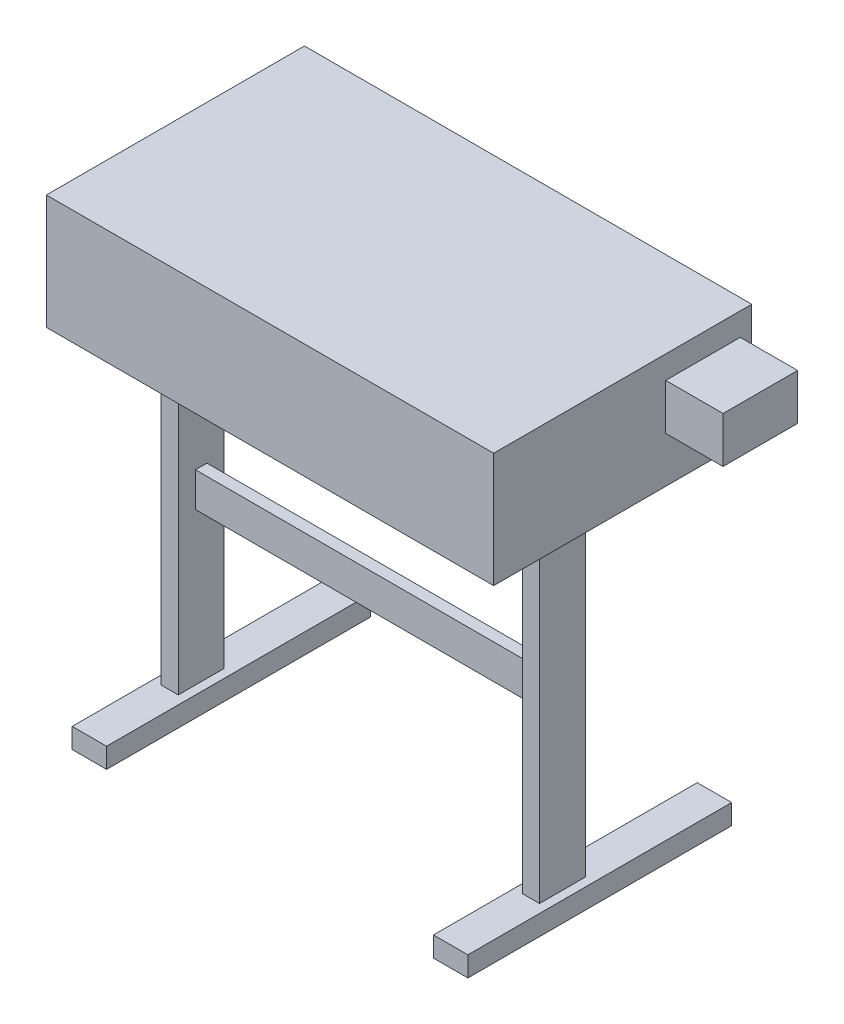
ISO-10303-21;
HEADER;
FILE_DESCRIPTION(('STEP AP214'),'2;1');
FILE_NAME('part.step','',(''),(''),'','','');
FILE_SCHEMA(('AUTOMOTIVE_DESIGN { 1 0 10303 214 1 1 1 1 }'));
ENDSEC;
DATA;
#1=APPLICATION_CONTEXT('core data for automotive mechanical design processes');
#2=APPLICATION_PROTOCOL_DEFINITION('international standard','automotive_design',2000,#1);
#3=PRODUCT_CONTEXT('',#1,'mechanical');
#4=PRODUCT('Part','Part','',(#3));
#5=PRODUCT_RELATED_PRODUCT_CATEGORY('part','',(#4));
#6=PRODUCT_DEFINITION_FORMATION('','',#4);
#7=PRODUCT_DEFINITION_CONTEXT('part definition',#1,'design');
#8=PRODUCT_DEFINITION('design','',#6,#7);
#9=PRODUCT_DEFINITION_SHAPE('','',#8);
#10=(LENGTH_UNIT() NAMED_UNIT(*) SI_UNIT(.MILLI.,.METRE.));
#11=(NAMED_UNIT(*) PLANE_ANGLE_UNIT() SI_UNIT($,.RADIAN.));
#12=(NAMED_UNIT(*) SI_UNIT($,.STERADIAN.) SOLID_ANGLE_UNIT());
#13=UNCERTAINTY_MEASURE_WITH_UNIT(LENGTH_MEASURE(1.E-05),#10,'distance_accuracy_value','');
#14=(GEOMETRIC_REPRESENTATION_CONTEXT(3) GLOBAL_UNCERTAINTY_ASSIGNED_CONTEXT((#13)) GLOBAL_UNIT_ASSIGNED_CONTEXT((#10,
#11,#12)) REPRESENTATION_CONTEXT('',''));
#15=CARTESIAN_POINT('',(0.,0.,0.));
#16=DIRECTION('',(0.,0.,1.));
#17=DIRECTION('',(1.,0.,0.));
#18=AXIS2_PLACEMENT_3D('',#15,#16,#17);
#19=CARTESIAN_POINT('',(-419.1,-781.05,393.7));
#20=DIRECTION('',(-1.,0.,0.));
#21=DIRECTION('',(0.,0.,1.));
#22=AXIS2_PLACEMENT_3D('',#19,#20,#21);
#23=PLANE('',#22);
#24=DIRECTION('',(0.,1.,0.));
#25=VECTOR('',#24,1.);
#26=CARTESIAN_POINT('',(-419.1,-781.05,292.1));
#27=LINE('',#26,#25);
#28=CARTESIAN_POINT('',(-419.1,-736.6,292.1));
#29=VERTEX_POINT('',#28);
#30=CARTESIAN_POINT('',(-419.1,0.,292.1));
#31=VERTEX_POINT('',#30);
#32=EDGE_CURVE('E300',#29,#31,#27,.T.);
#33=ORIENTED_EDGE('',*,*,#32,.F.);
#34=DIRECTION('',(0.,0.,1.));
#35=VECTOR('',#34,1.);
#36=CARTESIAN_POINT('',(-419.1,-736.6,393.7));
#37=LINE('',#36,#35);
#38=CARTESIAN_POINT('',(-419.1,-736.6,393.7));
#39=VERTEX_POINT('',#38);
#40=EDGE_CURVE('E227',#29,#39,#37,.T.);
#41=ORIENTED_EDGE('',*,*,#40,.T.);
#42=DIRECTION('',(0.,1.,0.));
#43=VECTOR('',#42,1.);
#44=CARTESIAN_POINT('',(-419.1,-781.05,393.7));
#45=LINE('',#44,#43);
#46=CARTESIAN_POINT('',(-419.1,0.,393.7));
#47=VERTEX_POINT('',#46);
#48=EDGE_CURVE('E326',#39,#47,#45,.T.);
#49=ORIENTED_EDGE('',*,*,#48,.T.);
#50=DIRECTION('',(0.,0.,1.));
#51=VECTOR('',#50,1.);
#52=CARTESIAN_POINT('',(-419.1,0.,393.7));
#53=LINE('',#52,#51);
#54=EDGE_CURVE('E342',#31,#47,#53,.T.);
#55=ORIENTED_EDGE('',*,*,#54,.F.);
#56=EDGE_LOOP('',(#33,#41,#49,#55));
#57=FACE_BOUND('',#56,.T.);
#58=ADVANCED_FACE('F49',(#57),#23,.T.);
#59=CARTESIAN_POINT('',(-419.1,-781.05,292.1));
#60=DIRECTION('',(0.,0.,-1.));
#61=DIRECTION('',(-1.,0.,0.));
#62=AXIS2_PLACEMENT_3D('',#59,#60,#61);
#63=PLANE('',#62);
#64=DIRECTION('',(0.,1.,0.));
#65=VECTOR('',#64,1.);
#66=CARTESIAN_POINT('',(-381.,-781.05,292.1));
#67=LINE('',#66,#65);
#68=CARTESIAN_POINT('',(-381.,-736.6,292.1));
#69=VERTEX_POINT('',#68);
#70=CARTESIAN_POINT('',(-381.,0.,292.1));
#71=VERTEX_POINT('',#70);
#72=EDGE_CURVE('E331',#69,#71,#67,.T.);
#73=ORIENTED_EDGE('',*,*,#72,.F.);
#74=DIRECTION('',(-1.,0.,0.));
#75=VECTOR('',#74,1.);
#76=CARTESIAN_POINT('',(-419.1,-736.6,292.1));
#77=LINE('',#76,#75);
#78=EDGE_CURVE('E224',#69,#29,#77,.T.);
#79=ORIENTED_EDGE('',*,*,#78,.T.);
#80=ORIENTED_EDGE('',*,*,#32,.T.);
#81=DIRECTION('',(-1.,0.,0.));
#82=VECTOR('',#81,1.);
#83=CARTESIAN_POINT('',(-419.1,0.,292.1));
#84=LINE('',#83,#82);
#85=EDGE_CURVE('E328',#71,#31,#84,.T.);
#86=ORIENTED_EDGE('',*,*,#85,.F.);
#87=EDGE_LOOP('',(#73,#79,#80,#86));
#88=FACE_BOUND('',#87,.T.);
#89=ADVANCED_FACE('F376',(#88),#63,.T.);
#90=CARTESIAN_POINT('',(-381.,-781.05,393.7));
#91=DIRECTION('',(1.,0.,0.));
#92=DIRECTION('',(0.,0.,-1.));
#93=AXIS2_PLACEMENT_3D('',#90,#91,#92);
#94=PLANE('',#93);
#95=DIRECTION('',(0.,0.,-1.));
#96=VECTOR('',#95,1.);
#97=CARTESIAN_POINT('',(-381.,-400.05,330.200000000001));
#98=LINE('',#97,#96);
#99=CARTESIAN_POINT('',(-381.,-400.05,355.600000000001));
#100=VERTEX_POINT('',#99);
#101=CARTESIAN_POINT('',(-381.,-400.05,330.2));
#102=VERTEX_POINT('',#101);
#103=EDGE_CURVE('E293',#100,#102,#98,.T.);
#104=ORIENTED_EDGE('',*,*,#103,.F.);
#105=DIRECTION('',(0.,-1.,0.));
#106=VECTOR('',#105,1.);
#107=CARTESIAN_POINT('',(-381.,-323.85,355.600000000001));
#108=LINE('',#107,#106);
#109=CARTESIAN_POINT('',(-381.,-323.85,355.600000000001));
#110=VERTEX_POINT('',#109);
#111=EDGE_CURVE('E290',#110,#100,#108,.T.);
#112=ORIENTED_EDGE('',*,*,#111,.F.);
#113=DIRECTION('',(0.,0.,1.));
#114=VECTOR('',#113,1.);
#115=CARTESIAN_POINT('',(-381.,-323.85,330.200000000001));
#116=LINE('',#115,#114);
#117=CARTESIAN_POINT('',(-381.,-323.85,330.2));
#118=VERTEX_POINT('',#117);
#119=EDGE_CURVE('E294',#118,#110,#116,.T.);
#120=ORIENTED_EDGE('',*,*,#119,.F.);
#121=DIRECTION('',(0.,1.,0.));
#122=VECTOR('',#121,1.);
#123=CARTESIAN_POINT('',(-381.,-323.85,330.200000000001));
#124=LINE('',#123,#122);
#125=EDGE_CURVE('E297',#102,#118,#124,.T.);
#126=ORIENTED_EDGE('',*,*,#125,.F.);
#127=EDGE_LOOP('',(#104,#112,#120,#126));
#128=FACE_BOUND('',#127,.T.);
#129=DIRECTION('',(0.,1.,0.));
#130=VECTOR('',#129,1.);
#131=CARTESIAN_POINT('',(-381.,-781.05,393.7));
#132=LINE('',#131,#130);
#133=CARTESIAN_POINT('',(-381.,-736.6,393.7));
#134=VERTEX_POINT('',#133);
#135=CARTESIAN_POINT('',(-381.,0.,393.7));
#136=VERTEX_POINT('',#135);
#137=EDGE_CURVE('E329',#134,#136,#132,.T.);
#138=ORIENTED_EDGE('',*,*,#137,.F.);
#139=DIRECTION('',(0.,0.,-1.));
#140=VECTOR('',#139,1.);
#141=CARTESIAN_POINT('',(-381.,-736.6,393.7));
#142=LINE('',#141,#140);
#143=EDGE_CURVE('E64',#134,#69,#142,.T.);
#144=ORIENTED_EDGE('',*,*,#143,.T.);
#145=ORIENTED_EDGE('',*,*,#72,.T.);
#146=DIRECTION('',(0.,0.,-1.));
#147=VECTOR('',#146,1.);
#148=CARTESIAN_POINT('',(-381.,0.,393.7));
#149=LINE('',#148,#147);
#150=EDGE_CURVE('E336',#136,#71,#149,.T.);
#151=ORIENTED_EDGE('',*,*,#150,.F.);
#152=EDGE_LOOP('',(#138,#144,#145,#151));
#153=FACE_BOUND('',#152,.T.);
#154=ADVANCED_FACE('F383',(#128,#153),#94,.T.);
#155=CARTESIAN_POINT('',(-419.1,-781.05,393.7));
#156=DIRECTION('',(0.,0.,1.));
#157=DIRECTION('',(1.,0.,0.));
#158=AXIS2_PLACEMENT_3D('',#155,#156,#157);
#159=PLANE('',#158);
#160=ORIENTED_EDGE('',*,*,#48,.F.);
#161=DIRECTION('',(1.,0.,0.));
#162=VECTOR('',#161,1.);
#163=CARTESIAN_POINT('',(-419.1,-736.6,393.7));
#164=LINE('',#163,#162);
#165=EDGE_CURVE('E12',#39,#134,#164,.T.);
#166=ORIENTED_EDGE('',*,*,#165,.T.);
#167=ORIENTED_EDGE('',*,*,#137,.T.);
#168=DIRECTION('',(1.,0.,0.));
#169=VECTOR('',#168,1.);
#170=CARTESIAN_POINT('',(-419.1,0.,393.7));
#171=LINE('',#170,#169);
#172=EDGE_CURVE('E339',#47,#136,#171,.T.);
#173=ORIENTED_EDGE('',*,*,#172,.F.);
#174=EDGE_LOOP('',(#160,#166,#167,#173));
#175=FACE_BOUND('',#174,.T.);
#176=ADVANCED_FACE('F371',(#175),#159,.T.);
#177=CARTESIAN_POINT('',(381.,-781.05,393.7));
#178=DIRECTION('',(-1.,0.,0.));
#179=DIRECTION('',(0.,0.,1.));
#180=AXIS2_PLACEMENT_3D('',#177,#178,#179);
#181=PLANE('',#180);
#182=DIRECTION('',(0.,-1.,0.));
#183=VECTOR('',#182,1.);
#184=CARTESIAN_POINT('',(381.,-323.85,330.2));
#185=LINE('',#184,#183);
#186=CARTESIAN_POINT('',(381.,-323.85,330.2));
#187=VERTEX_POINT('',#186);
#188=CARTESIAN_POINT('',(381.,-400.05,330.2));
#189=VERTEX_POINT('',#188);
#190=EDGE_CURVE('E284',#187,#189,#185,.T.);
#191=ORIENTED_EDGE('',*,*,#190,.F.);
#192=DIRECTION('',(0.,0.,-1.));
#193=VECTOR('',#192,1.);
#194=CARTESIAN_POINT('',(381.,-323.85,330.2));
#195=LINE('',#194,#193);
#196=CARTESIAN_POINT('',(381.,-323.85,355.6));
#197=VERTEX_POINT('',#196);
#198=EDGE_CURVE('E309',#197,#187,#195,.T.);
#199=ORIENTED_EDGE('',*,*,#198,.F.);
#200=DIRECTION('',(0.,1.,0.));
#201=VECTOR('',#200,1.);
#202=CARTESIAN_POINT('',(381.,-323.85,355.6));
#203=LINE('',#202,#201);
#204=CARTESIAN_POINT('',(381.,-400.05,355.6));
#205=VERTEX_POINT('',#204);
#206=EDGE_CURVE('E306',#205,#197,#203,.T.);
#207=ORIENTED_EDGE('',*,*,#206,.F.);
#208=DIRECTION('',(0.,0.,1.));
#209=VECTOR('',#208,1.);
#210=CARTESIAN_POINT('',(381.,-400.05,330.2));
#211=LINE('',#210,#209);
#212=EDGE_CURVE('E303',#189,#205,#211,.T.);
#213=ORIENTED_EDGE('',*,*,#212,.F.);
#214=EDGE_LOOP('',(#191,#199,#207,#213));
#215=FACE_BOUND('',#214,.T.);
#216=DIRECTION('',(0.,1.,0.));
#217=VECTOR('',#216,1.);
#218=CARTESIAN_POINT('',(381.,-781.05,292.1));
#219=LINE('',#218,#217);
#220=CARTESIAN_POINT('',(381.,-736.6,292.1));
#221=VERTEX_POINT('',#220);
#222=CARTESIAN_POINT('',(381.,0.,292.1));
#223=VERTEX_POINT('',#222);
#224=EDGE_CURVE('E282',#221,#223,#219,.T.);
#225=ORIENTED_EDGE('',*,*,#224,.F.);
#226=DIRECTION('',(0.,0.,1.));
#227=VECTOR('',#226,1.);
#228=CARTESIAN_POINT('',(381.,-736.6,393.7));
#229=LINE('',#228,#227);
#230=CARTESIAN_POINT('',(381.,-736.6,393.7));
#231=VERTEX_POINT('',#230);
#232=EDGE_CURVE('E266',#221,#231,#229,.T.);
#233=ORIENTED_EDGE('',*,*,#232,.T.);
#234=DIRECTION('',(0.,1.,0.));
#235=VECTOR('',#234,1.);
#236=CARTESIAN_POINT('',(381.,-781.05,393.7));
#237=LINE('',#236,#235);
#238=CARTESIAN_POINT('',(381.,0.,393.7));
#239=VERTEX_POINT('',#238);
#240=EDGE_CURVE('E281',#231,#239,#237,.T.);
#241=ORIENTED_EDGE('',*,*,#240,.T.);
#242=DIRECTION('',(0.,0.,1.));
#243=VECTOR('',#242,1.);
#244=CARTESIAN_POINT('',(381.,0.,393.7));
#245=LINE('',#244,#243);
#246=EDGE_CURVE('E269',#223,#239,#245,.T.);
#247=ORIENTED_EDGE('',*,*,#246,.F.);
#248=EDGE_LOOP('',(#225,#233,#241,#247));
#249=FACE_BOUND('',#248,.T.);
#250=ADVANCED_FACE('F359',(#215,#249),#181,.T.);
#251=CARTESIAN_POINT('',(381.,-781.05,292.1));
#252=DIRECTION('',(0.,0.,-1.));
#253=DIRECTION('',(-1.,0.,0.));
#254=AXIS2_PLACEMENT_3D('',#251,#252,#253);
#255=PLANE('',#254);
#256=DIRECTION('',(0.,1.,0.));
#257=VECTOR('',#256,1.);
#258=CARTESIAN_POINT('',(419.1,-781.05,292.1));
#259=LINE('',#258,#257);
#260=CARTESIAN_POINT('',(419.1,-736.6,292.1));
#261=VERTEX_POINT('',#260);
#262=CARTESIAN_POINT('',(419.1,0.,292.1));
#263=VERTEX_POINT('',#262);
#264=EDGE_CURVE('E285',#261,#263,#259,.T.);
#265=ORIENTED_EDGE('',*,*,#264,.F.);
#266=DIRECTION('',(-1.,0.,0.));
#267=VECTOR('',#266,1.);
#268=CARTESIAN_POINT('',(381.,-736.6,292.1));
#269=LINE('',#268,#267);
#270=EDGE_CURVE('E263',#261,#221,#269,.T.);
#271=ORIENTED_EDGE('',*,*,#270,.T.);
#272=ORIENTED_EDGE('',*,*,#224,.T.);
#273=DIRECTION('',(-1.,0.,0.));
#274=VECTOR('',#273,1.);
#275=CARTESIAN_POINT('',(381.,0.,292.1));
#276=LINE('',#275,#274);
#277=EDGE_CURVE('E278',#263,#223,#276,.T.);
#278=ORIENTED_EDGE('',*,*,#277,.F.);
#279=EDGE_LOOP('',(#265,#271,#272,#278));
#280=FACE_BOUND('',#279,.T.);
#281=ADVANCED_FACE('F363',(#280),#255,.T.);
#282=CARTESIAN_POINT('',(419.1,-781.05,393.7));
#283=DIRECTION('',(1.,0.,0.));
#284=DIRECTION('',(0.,0.,-1.));
#285=AXIS2_PLACEMENT_3D('',#282,#283,#284);
#286=PLANE('',#285);
#287=DIRECTION('',(0.,1.,0.));
#288=VECTOR('',#287,1.);
#289=CARTESIAN_POINT('',(419.1,-781.05,393.7));
#290=LINE('',#289,#288);
#291=CARTESIAN_POINT('',(419.1,-736.6,393.7));
#292=VERTEX_POINT('',#291);
#293=CARTESIAN_POINT('',(419.1,0.,393.7));
#294=VERTEX_POINT('',#293);
#295=EDGE_CURVE('E287',#292,#294,#290,.T.);
#296=ORIENTED_EDGE('',*,*,#295,.F.);
#297=DIRECTION('',(0.,0.,-1.));
#298=VECTOR('',#297,1.);
#299=CARTESIAN_POINT('',(419.1,-736.6,393.7));
#300=LINE('',#299,#298);
#301=EDGE_CURVE('E71',#292,#261,#300,.T.);
#302=ORIENTED_EDGE('',*,*,#301,.T.);
#303=ORIENTED_EDGE('',*,*,#264,.T.);
#304=DIRECTION('',(0.,0.,-1.));
#305=VECTOR('',#304,1.);
#306=CARTESIAN_POINT('',(419.1,0.,393.7));
#307=LINE('',#306,#305);
#308=EDGE_CURVE('E275',#294,#263,#307,.T.);
#309=ORIENTED_EDGE('',*,*,#308,.F.);
#310=EDGE_LOOP('',(#296,#302,#303,#309));
#311=FACE_BOUND('',#310,.T.);
#312=ADVANCED_FACE('F351',(#311),#286,.T.);
#313=CARTESIAN_POINT('',(381.,-781.05,393.7));
#314=DIRECTION('',(0.,0.,1.));
#315=DIRECTION('',(1.,0.,0.));
#316=AXIS2_PLACEMENT_3D('',#313,#314,#315);
#317=PLANE('',#316);
#318=ORIENTED_EDGE('',*,*,#240,.F.);
#319=DIRECTION('',(1.,0.,0.));
#320=VECTOR('',#319,1.);
#321=CARTESIAN_POINT('',(381.,-736.6,393.7));
#322=LINE('',#321,#320);
#323=EDGE_CURVE('E57',#231,#292,#322,.T.);
#324=ORIENTED_EDGE('',*,*,#323,.T.);
#325=ORIENTED_EDGE('',*,*,#295,.T.);
#326=DIRECTION('',(1.,0.,0.));
#327=VECTOR('',#326,1.);
#328=CARTESIAN_POINT('',(381.,0.,393.7));
#329=LINE('',#328,#327);
#330=EDGE_CURVE('E272',#239,#294,#329,.T.);
#331=ORIENTED_EDGE('',*,*,#330,.F.);
#332=EDGE_LOOP('',(#318,#324,#325,#331));
#333=FACE_BOUND('',#332,.T.);
#334=ADVANCED_FACE('F347',(#333),#317,.T.);
#335=CARTESIAN_POINT('',(0.,0.,0.));
#336=DIRECTION('',(0.,-1.,0.));
#337=DIRECTION('',(0.,0.,-1.));
#338=AXIS2_PLACEMENT_3D('',#335,#336,#337);
#339=PLANE('',#338);
#340=ORIENTED_EDGE('',*,*,#54,.T.);
#341=ORIENTED_EDGE('',*,*,#172,.T.);
#342=ORIENTED_EDGE('',*,*,#150,.T.);
#343=ORIENTED_EDGE('',*,*,#85,.T.);
#344=EDGE_LOOP('',(#340,#341,#342,#343));
#345=FACE_BOUND('',#344,.T.);
#346=ADVANCED_FACE('F396',(#345),#339,.F.);
#347=CARTESIAN_POINT('',(-461.321852568277,-323.85,330.200000000001));
#348=DIRECTION('',(0.,-1.,0.));
#349=DIRECTION('',(0.,0.,-1.));
#350=AXIS2_PLACEMENT_3D('',#347,#348,#349);
#351=PLANE('',#350);
#352=DIRECTION('',(1.,0.,0.));
#353=VECTOR('',#352,1.);
#354=CARTESIAN_POINT('',(-461.321852568277,-323.85,330.200000000001));
#355=LINE('',#354,#353);
#356=EDGE_CURVE('E312',#118,#187,#355,.T.);
#357=ORIENTED_EDGE('',*,*,#356,.F.);
#358=ORIENTED_EDGE('',*,*,#119,.T.);
#359=DIRECTION('',(1.,0.,0.));
#360=VECTOR('',#359,1.);
#361=CARTESIAN_POINT('',(-461.321852568277,-323.85,355.600000000001));
#362=LINE('',#361,#360);
#363=EDGE_CURVE('E315',#110,#197,#362,.T.);
#364=ORIENTED_EDGE('',*,*,#363,.T.);
#365=ORIENTED_EDGE('',*,*,#198,.T.);
#366=EDGE_LOOP('',(#357,#358,#364,#365));
#367=FACE_BOUND('',#366,.T.);
#368=ADVANCED_FACE('F398',(#367),#351,.F.);
#369=CARTESIAN_POINT('',(-461.321852568277,-323.85,355.600000000001));
#370=DIRECTION('',(0.,0.,-1.));
#371=DIRECTION('',(-1.,0.,0.));
#372=AXIS2_PLACEMENT_3D('',#369,#370,#371);
#373=PLANE('',#372);
#374=ORIENTED_EDGE('',*,*,#363,.F.);
#375=ORIENTED_EDGE('',*,*,#111,.T.);
#376=DIRECTION('',(1.,0.,0.));
#377=VECTOR('',#376,1.);
#378=CARTESIAN_POINT('',(-461.321852568277,-400.05,355.600000000001));
#379=LINE('',#378,#377);
#380=EDGE_CURVE('E318',#100,#205,#379,.T.);
#381=ORIENTED_EDGE('',*,*,#380,.T.);
#382=ORIENTED_EDGE('',*,*,#206,.T.);
#383=EDGE_LOOP('',(#374,#375,#381,#382));
#384=FACE_BOUND('',#383,.T.);
#385=ADVANCED_FACE('F403',(#384),#373,.F.);
#386=CARTESIAN_POINT('',(-461.321852568277,-400.05,330.200000000001));
#387=DIRECTION('',(0.,1.,0.));
#388=DIRECTION('',(0.,0.,1.));
#389=AXIS2_PLACEMENT_3D('',#386,#387,#388);
#390=PLANE('',#389);
#391=ORIENTED_EDGE('',*,*,#380,.F.);
#392=ORIENTED_EDGE('',*,*,#103,.T.);
#393=DIRECTION('',(1.,0.,0.));
#394=VECTOR('',#393,1.);
#395=CARTESIAN_POINT('',(-461.321852568277,-400.05,330.200000000001));
#396=LINE('',#395,#394);
#397=EDGE_CURVE('E321',#102,#189,#396,.T.);
#398=ORIENTED_EDGE('',*,*,#397,.T.);
#399=ORIENTED_EDGE('',*,*,#212,.T.);
#400=EDGE_LOOP('',(#391,#392,#398,#399));
#401=FACE_BOUND('',#400,.T.);
#402=ADVANCED_FACE('F465',(#401),#390,.F.);
#403=CARTESIAN_POINT('',(-461.321852568277,-323.85,330.200000000001));
#404=DIRECTION('',(0.,0.,1.));
#405=DIRECTION('',(1.,0.,0.));
#406=AXIS2_PLACEMENT_3D('',#403,#404,#405);
#407=PLANE('',#406);
#408=ORIENTED_EDGE('',*,*,#397,.F.);
#409=ORIENTED_EDGE('',*,*,#125,.T.);
#410=ORIENTED_EDGE('',*,*,#356,.T.);
#411=ORIENTED_EDGE('',*,*,#190,.T.);
#412=EDGE_LOOP('',(#408,#409,#410,#411));
#413=FACE_BOUND('',#412,.T.);
#414=ADVANCED_FACE('F389',(#413),#407,.F.);
#415=CARTESIAN_POINT('',(0.,0.,0.));
#416=DIRECTION('',(0.,-1.,0.));
#417=DIRECTION('',(0.,0.,-1.));
#418=AXIS2_PLACEMENT_3D('',#415,#416,#417);
#419=PLANE('',#418);
#420=ORIENTED_EDGE('',*,*,#246,.T.);
#421=ORIENTED_EDGE('',*,*,#330,.T.);
#422=ORIENTED_EDGE('',*,*,#308,.T.);
#423=ORIENTED_EDGE('',*,*,#277,.T.);
#424=EDGE_LOOP('',(#420,#421,#422,#423));
#425=FACE_BOUND('',#424,.T.);
#426=ADVANCED_FACE('F355',(#425),#419,.F.);
#427=CARTESIAN_POINT('',(361.95,-736.6,571.5));
#428=DIRECTION('',(-1.,0.,0.));
#429=DIRECTION('',(0.,0.,1.));
#430=AXIS2_PLACEMENT_3D('',#427,#428,#429);
#431=PLANE('',#430);
#432=DIRECTION('',(0.,0.,-1.));
#433=VECTOR('',#432,1.);
#434=CARTESIAN_POINT('',(361.95,-781.05,571.5));
#435=LINE('',#434,#433);
#436=CARTESIAN_POINT('',(361.95,-781.05,571.5));
#437=VERTEX_POINT('',#436);
#438=CARTESIAN_POINT('',(361.95,-781.05,-12.6999999999999));
#439=VERTEX_POINT('',#438);
#440=EDGE_CURVE('E230',#437,#439,#435,.T.);
#441=ORIENTED_EDGE('',*,*,#440,.F.);
#442=DIRECTION('',(0.,-1.,0.));
#443=VECTOR('',#442,1.);
#444=CARTESIAN_POINT('',(361.95,-736.6,571.5));
#445=LINE('',#444,#443);
#446=CARTESIAN_POINT('',(361.95,-736.6,571.5));
#447=VERTEX_POINT('',#446);
#448=EDGE_CURVE('E255',#447,#437,#445,.T.);
#449=ORIENTED_EDGE('',*,*,#448,.F.);
#450=DIRECTION('',(0.,0.,-1.));
#451=VECTOR('',#450,1.);
#452=CARTESIAN_POINT('',(361.95,-736.6,571.5));
#453=LINE('',#452,#451);
#454=CARTESIAN_POINT('',(361.95,-736.6,-12.6999999999999));
#455=VERTEX_POINT('',#454);
#456=EDGE_CURVE('E231',#447,#455,#453,.T.);
#457=ORIENTED_EDGE('',*,*,#456,.T.);
#458=DIRECTION('',(0.,-1.,0.));
#459=VECTOR('',#458,1.);
#460=CARTESIAN_POINT('',(361.95,-736.6,-12.6999999999999));
#461=LINE('',#460,#459);
#462=EDGE_CURVE('E244',#455,#439,#461,.T.);
#463=ORIENTED_EDGE('',*,*,#462,.T.);
#464=EDGE_LOOP('',(#441,#449,#457,#463));
#465=FACE_BOUND('',#464,.T.);
#466=ADVANCED_FACE('F447',(#465),#431,.T.);
#467=CARTESIAN_POINT('',(361.95,-736.6,571.5));
#468=DIRECTION('',(0.,0.,1.));
#469=DIRECTION('',(1.,0.,0.));
#470=AXIS2_PLACEMENT_3D('',#467,#468,#469);
#471=PLANE('',#470);
#472=DIRECTION('',(-1.,0.,0.));
#473=VECTOR('',#472,1.);
#474=CARTESIAN_POINT('',(361.95,-781.05,571.5));
#475=LINE('',#474,#473);
#476=CARTESIAN_POINT('',(438.15,-781.05,571.5));
#477=VERTEX_POINT('',#476);
#478=EDGE_CURVE('E235',#477,#437,#475,.T.);
#479=ORIENTED_EDGE('',*,*,#478,.F.);
#480=DIRECTION('',(0.,-1.,0.));
#481=VECTOR('',#480,1.);
#482=CARTESIAN_POINT('',(438.15,-736.6,571.5));
#483=LINE('',#482,#481);
#484=CARTESIAN_POINT('',(438.15,-736.6,571.5));
#485=VERTEX_POINT('',#484);
#486=EDGE_CURVE('E257',#485,#477,#483,.T.);
#487=ORIENTED_EDGE('',*,*,#486,.F.);
#488=DIRECTION('',(-1.,0.,0.));
#489=VECTOR('',#488,1.);
#490=CARTESIAN_POINT('',(361.95,-736.6,571.5));
#491=LINE('',#490,#489);
#492=EDGE_CURVE('E241',#485,#447,#491,.T.);
#493=ORIENTED_EDGE('',*,*,#492,.T.);
#494=ORIENTED_EDGE('',*,*,#448,.T.);
#495=EDGE_LOOP('',(#479,#487,#493,#494));
#496=FACE_BOUND('',#495,.T.);
#497=ADVANCED_FACE('F443',(#496),#471,.T.);
#498=CARTESIAN_POINT('',(438.15,-736.6,571.5));
#499=DIRECTION('',(1.,0.,0.));
#500=DIRECTION('',(0.,0.,-1.));
#501=AXIS2_PLACEMENT_3D('',#498,#499,#500);
#502=PLANE('',#501);
#503=DIRECTION('',(0.,0.,1.));
#504=VECTOR('',#503,1.);
#505=CARTESIAN_POINT('',(438.15,-781.05,571.5));
#506=LINE('',#505,#504);
#507=CARTESIAN_POINT('',(438.15,-781.05,-12.6999999999999));
#508=VERTEX_POINT('',#507);
#509=EDGE_CURVE('E250',#508,#477,#506,.T.);
#510=ORIENTED_EDGE('',*,*,#509,.F.);
#511=DIRECTION('',(0.,-1.,0.));
#512=VECTOR('',#511,1.);
#513=CARTESIAN_POINT('',(438.15,-736.6,-12.6999999999999));
#514=LINE('',#513,#512);
#515=CARTESIAN_POINT('',(438.15,-736.6,-12.6999999999999));
#516=VERTEX_POINT('',#515);
#517=EDGE_CURVE('E259',#516,#508,#514,.T.);
#518=ORIENTED_EDGE('',*,*,#517,.F.);
#519=DIRECTION('',(0.,0.,1.));
#520=VECTOR('',#519,1.);
#521=CARTESIAN_POINT('',(438.15,-736.6,571.5));
#522=LINE('',#521,#520);
#523=EDGE_CURVE('E238',#516,#485,#522,.T.);
#524=ORIENTED_EDGE('',*,*,#523,.T.);
#525=ORIENTED_EDGE('',*,*,#486,.T.);
#526=EDGE_LOOP('',(#510,#518,#524,#525));
#527=FACE_BOUND('',#526,.T.);
#528=ADVANCED_FACE('F446',(#527),#502,.T.);
#529=CARTESIAN_POINT('',(361.95,-736.6,-12.6999999999999));
#530=DIRECTION('',(0.,0.,-1.));
#531=DIRECTION('',(-1.,0.,0.));
#532=AXIS2_PLACEMENT_3D('',#529,#530,#531);
#533=PLANE('',#532);
#534=DIRECTION('',(1.,0.,0.));
#535=VECTOR('',#534,1.);
#536=CARTESIAN_POINT('',(361.95,-781.05,-12.6999999999999));
#537=LINE('',#536,#535);
#538=EDGE_CURVE('E247',#439,#508,#537,.T.);
#539=ORIENTED_EDGE('',*,*,#538,.F.);
#540=ORIENTED_EDGE('',*,*,#462,.F.);
#541=DIRECTION('',(1.,0.,0.));
#542=VECTOR('',#541,1.);
#543=CARTESIAN_POINT('',(361.95,-736.6,-12.6999999999999));
#544=LINE('',#543,#542);
#545=EDGE_CURVE('E234',#455,#516,#544,.T.);
#546=ORIENTED_EDGE('',*,*,#545,.T.);
#547=ORIENTED_EDGE('',*,*,#517,.T.);
#548=EDGE_LOOP('',(#539,#540,#546,#547));
#549=FACE_BOUND('',#548,.T.);
#550=ADVANCED_FACE('F442',(#549),#533,.T.);
#551=CARTESIAN_POINT('',(0.,-736.6,0.));
#552=DIRECTION('',(0.,-1.,0.));
#553=DIRECTION('',(0.,0.,-1.));
#554=AXIS2_PLACEMENT_3D('',#551,#552,#553);
#555=PLANE('',#554);
#556=ORIENTED_EDGE('',*,*,#232,.F.);
#557=ORIENTED_EDGE('',*,*,#270,.F.);
#558=ORIENTED_EDGE('',*,*,#301,.F.);
#559=ORIENTED_EDGE('',*,*,#323,.F.);
#560=EDGE_LOOP('',(#556,#557,#558,#559));
#561=FACE_BOUND('',#560,.T.);
#562=ORIENTED_EDGE('',*,*,#456,.F.);
#563=ORIENTED_EDGE('',*,*,#492,.F.);
#564=ORIENTED_EDGE('',*,*,#523,.F.);
#565=ORIENTED_EDGE('',*,*,#545,.F.);
#566=EDGE_LOOP('',(#562,#563,#564,#565));
#567=FACE_BOUND('',#566,.T.);
#568=ADVANCED_FACE('F360',(#561,#567),#555,.F.);
#569=CARTESIAN_POINT('',(0.,-781.05,0.));
#570=DIRECTION('',(0.,-1.,0.));
#571=DIRECTION('',(0.,0.,-1.));
#572=AXIS2_PLACEMENT_3D('',#569,#570,#571);
#573=PLANE('',#572);
#574=ORIENTED_EDGE('',*,*,#440,.T.);
#575=ORIENTED_EDGE('',*,*,#538,.T.);
#576=ORIENTED_EDGE('',*,*,#509,.T.);
#577=ORIENTED_EDGE('',*,*,#478,.T.);
#578=EDGE_LOOP('',(#574,#575,#576,#577));
#579=FACE_BOUND('',#578,.T.);
#580=ADVANCED_FACE('F441',(#579),#573,.T.);
#581=CARTESIAN_POINT('',(-438.15,-736.6,571.5));
#582=DIRECTION('',(-1.,0.,0.));
#583=DIRECTION('',(0.,0.,1.));
#584=AXIS2_PLACEMENT_3D('',#581,#582,#583);
#585=PLANE('',#584);
#586=DIRECTION('',(0.,0.,-1.));
#587=VECTOR('',#586,1.);
#588=CARTESIAN_POINT('',(-438.15,-781.05,571.5));
#589=LINE('',#588,#587);
#590=CARTESIAN_POINT('',(-438.15,-781.05,571.5));
#591=VERTEX_POINT('',#590);
#592=CARTESIAN_POINT('',(-438.15,-781.05,-12.6999999999999));
#593=VERTEX_POINT('',#592);
#594=EDGE_CURVE('E198',#591,#593,#589,.T.);
#595=ORIENTED_EDGE('',*,*,#594,.F.);
#596=DIRECTION('',(0.,-1.,0.));
#597=VECTOR('',#596,1.);
#598=CARTESIAN_POINT('',(-438.15,-736.6,571.5));
#599=LINE('',#598,#597);
#600=CARTESIAN_POINT('',(-438.15,-736.6,571.5));
#601=VERTEX_POINT('',#600);
#602=EDGE_CURVE('E185',#601,#591,#599,.T.);
#603=ORIENTED_EDGE('',*,*,#602,.F.);
#604=DIRECTION('',(0.,0.,-1.));
#605=VECTOR('',#604,1.);
#606=CARTESIAN_POINT('',(-438.15,-736.6,571.5));
#607=LINE('',#606,#605);
#608=CARTESIAN_POINT('',(-438.15,-736.6,-12.6999999999999));
#609=VERTEX_POINT('',#608);
#610=EDGE_CURVE('E209',#601,#609,#607,.T.);
#611=ORIENTED_EDGE('',*,*,#610,.T.);
#612=DIRECTION('',(0.,-1.,0.));
#613=VECTOR('',#612,1.);
#614=CARTESIAN_POINT('',(-438.15,-736.6,-12.6999999999999));
#615=LINE('',#614,#613);
#616=EDGE_CURVE('E200',#609,#593,#615,.T.);
#617=ORIENTED_EDGE('',*,*,#616,.T.);
#618=EDGE_LOOP('',(#595,#603,#611,#617));
#619=FACE_BOUND('',#618,.T.);
#620=ADVANCED_FACE('F199',(#619),#585,.T.);
#621=CARTESIAN_POINT('',(-438.15,-736.6,571.5));
#622=DIRECTION('',(0.,0.,1.));
#623=DIRECTION('',(1.,0.,0.));
#624=AXIS2_PLACEMENT_3D('',#621,#622,#623);
#625=PLANE('',#624);
#626=DIRECTION('',(-1.,0.,0.));
#627=VECTOR('',#626,1.);
#628=CARTESIAN_POINT('',(-438.15,-781.05,571.5));
#629=LINE('',#628,#627);
#630=CARTESIAN_POINT('',(-361.95,-781.05,571.5));
#631=VERTEX_POINT('',#630);
#632=EDGE_CURVE('E189',#631,#591,#629,.T.);
#633=ORIENTED_EDGE('',*,*,#632,.F.);
#634=DIRECTION('',(0.,-1.,0.));
#635=VECTOR('',#634,1.);
#636=CARTESIAN_POINT('',(-361.95,-736.6,571.5));
#637=LINE('',#636,#635);
#638=CARTESIAN_POINT('',(-361.95,-736.6,571.5));
#639=VERTEX_POINT('',#638);
#640=EDGE_CURVE('E195',#639,#631,#637,.T.);
#641=ORIENTED_EDGE('',*,*,#640,.F.);
#642=DIRECTION('',(-1.,0.,0.));
#643=VECTOR('',#642,1.);
#644=CARTESIAN_POINT('',(-438.15,-736.6,571.5));
#645=LINE('',#644,#643);
#646=EDGE_CURVE('E191',#639,#601,#645,.T.);
#647=ORIENTED_EDGE('',*,*,#646,.T.);
#648=ORIENTED_EDGE('',*,*,#602,.T.);
#649=EDGE_LOOP('',(#633,#641,#647,#648));
#650=FACE_BOUND('',#649,.T.);
#651=ADVANCED_FACE('F187',(#650),#625,.T.);
#652=CARTESIAN_POINT('',(-361.95,-736.6,571.5));
#653=DIRECTION('',(1.,0.,0.));
#654=DIRECTION('',(0.,0.,-1.));
#655=AXIS2_PLACEMENT_3D('',#652,#653,#654);
#656=PLANE('',#655);
#657=DIRECTION('',(0.,0.,1.));
#658=VECTOR('',#657,1.);
#659=CARTESIAN_POINT('',(-361.95,-781.05,571.5));
#660=LINE('',#659,#658);
#661=CARTESIAN_POINT('',(-361.95,-781.05,-12.6999999999999));
#662=VERTEX_POINT('',#661);
#663=EDGE_CURVE('E208',#662,#631,#660,.T.);
#664=ORIENTED_EDGE('',*,*,#663,.F.);
#665=DIRECTION('',(0.,-1.,0.));
#666=VECTOR('',#665,1.);
#667=CARTESIAN_POINT('',(-361.95,-736.6,-12.6999999999999));
#668=LINE('',#667,#666);
#669=CARTESIAN_POINT('',(-361.95,-736.6,-12.6999999999999));
#670=VERTEX_POINT('',#669);
#671=EDGE_CURVE('E424',#670,#662,#668,.T.);
#672=ORIENTED_EDGE('',*,*,#671,.F.);
#673=DIRECTION('',(0.,0.,1.));
#674=VECTOR('',#673,1.);
#675=CARTESIAN_POINT('',(-361.95,-736.6,571.5));
#676=LINE('',#675,#674);
#677=EDGE_CURVE('E218',#670,#639,#676,.T.);
#678=ORIENTED_EDGE('',*,*,#677,.T.);
#679=ORIENTED_EDGE('',*,*,#640,.T.);
#680=EDGE_LOOP('',(#664,#672,#678,#679));
#681=FACE_BOUND('',#680,.T.);
#682=ADVANCED_FACE('F428',(#681),#656,.T.);
#683=CARTESIAN_POINT('',(-438.15,-736.6,-12.6999999999999));
#684=DIRECTION('',(0.,0.,-1.));
#685=DIRECTION('',(-1.,0.,0.));
#686=AXIS2_PLACEMENT_3D('',#683,#684,#685);
#687=PLANE('',#686);
#688=DIRECTION('',(1.,0.,0.));
#689=VECTOR('',#688,1.);
#690=CARTESIAN_POINT('',(-438.15,-781.05,-12.6999999999999));
#691=LINE('',#690,#689);
#692=EDGE_CURVE('E204',#593,#662,#691,.T.);
#693=ORIENTED_EDGE('',*,*,#692,.F.);
#694=ORIENTED_EDGE('',*,*,#616,.F.);
#695=DIRECTION('',(1.,0.,0.));
#696=VECTOR('',#695,1.);
#697=CARTESIAN_POINT('',(-438.15,-736.6,-12.6999999999999));
#698=LINE('',#697,#696);
#699=EDGE_CURVE('E212',#609,#670,#698,.T.);
#700=ORIENTED_EDGE('',*,*,#699,.T.);
#701=ORIENTED_EDGE('',*,*,#671,.T.);
#702=EDGE_LOOP('',(#693,#694,#700,#701));
#703=FACE_BOUND('',#702,.T.);
#704=ADVANCED_FACE('F419',(#703),#687,.T.);
#705=CARTESIAN_POINT('',(0.,-736.6,0.));
#706=DIRECTION('',(0.,-1.,0.));
#707=DIRECTION('',(0.,0.,-1.));
#708=AXIS2_PLACEMENT_3D('',#705,#706,#707);
#709=PLANE('',#708);
#710=ORIENTED_EDGE('',*,*,#40,.F.);
#711=ORIENTED_EDGE('',*,*,#78,.F.);
#712=ORIENTED_EDGE('',*,*,#143,.F.);
#713=ORIENTED_EDGE('',*,*,#165,.F.);
#714=EDGE_LOOP('',(#710,#711,#712,#713));
#715=FACE_BOUND('',#714,.T.);
#716=ORIENTED_EDGE('',*,*,#610,.F.);
#717=ORIENTED_EDGE('',*,*,#646,.F.);
#718=ORIENTED_EDGE('',*,*,#677,.F.);
#719=ORIENTED_EDGE('',*,*,#699,.F.);
#720=EDGE_LOOP('',(#716,#717,#718,#719));
#721=FACE_BOUND('',#720,.T.);
#722=ADVANCED_FACE('F416',(#715,#721),#709,.F.);
#723=CARTESIAN_POINT('',(0.,-781.05,0.));
#724=DIRECTION('',(0.,-1.,0.));
#725=DIRECTION('',(0.,0.,-1.));
#726=AXIS2_PLACEMENT_3D('',#723,#724,#725);
#727=PLANE('',#726);
#728=ORIENTED_EDGE('',*,*,#594,.T.);
#729=ORIENTED_EDGE('',*,*,#692,.T.);
#730=ORIENTED_EDGE('',*,*,#663,.T.);
#731=ORIENTED_EDGE('',*,*,#632,.T.);
#732=EDGE_LOOP('',(#728,#729,#730,#731));
#733=FACE_BOUND('',#732,.T.);
#734=ADVANCED_FACE('F51',(#733),#727,.T.);
#735=CLOSED_SHELL('',(#58,#89,#154,#176,#250,#281,#312,#334,#346,#368,#385,#402,#414,#426,#466,
#497,#528,#550,#568,#580,#620,#651,#682,#704,#722,#734));
#736=MANIFOLD_SOLID_BREP('B2',#735);
#737=CARTESIAN_POINT('',(495.3,254.,0.));
#738=DIRECTION('',(-1.,0.,0.));
#739=DIRECTION('',(0.,0.,1.));
#740=AXIS2_PLACEMENT_3D('',#737,#738,#739);
#741=PLANE('',#740);
#742=DIRECTION('',(0.,0.,-1.));
#743=VECTOR('',#742,1.);
#744=CARTESIAN_POINT('',(495.3,0.,0.));
#745=LINE('',#744,#743);
#746=CARTESIAN_POINT('',(495.3,0.,571.5));
#747=VERTEX_POINT('',#746);
#748=CARTESIAN_POINT('',(495.3,0.,0.));
#749=VERTEX_POINT('',#748);
#750=EDGE_CURVE('E849',#747,#749,#745,.T.);
#751=ORIENTED_EDGE('',*,*,#750,.T.);
#752=DIRECTION('',(0.,-1.,0.));
#753=VECTOR('',#752,1.);
#754=CARTESIAN_POINT('',(495.3,254.,0.));
#755=LINE('',#754,#753);
#756=CARTESIAN_POINT('',(495.3,254.,0.));
#757=VERTEX_POINT('',#756);
#758=EDGE_CURVE('E854',#757,#749,#755,.T.);
#759=ORIENTED_EDGE('',*,*,#758,.F.);
#760=DIRECTION('',(0.,0.,-1.));
#761=VECTOR('',#760,1.);
#762=CARTESIAN_POINT('',(495.3,254.,0.));
#763=LINE('',#762,#761);
#764=CARTESIAN_POINT('',(495.3,254.,571.5));
#765=VERTEX_POINT('',#764);
#766=EDGE_CURVE('E843',#765,#757,#763,.T.);
#767=ORIENTED_EDGE('',*,*,#766,.F.);
#768=DIRECTION('',(0.,-1.,0.));
#769=VECTOR('',#768,1.);
#770=CARTESIAN_POINT('',(495.3,254.,571.5));
#771=LINE('',#770,#769);
#772=EDGE_CURVE('E750',#765,#747,#771,.T.);
#773=ORIENTED_EDGE('',*,*,#772,.T.);
#774=EDGE_LOOP('',(#751,#759,#767,#773));
#775=FACE_BOUND('',#774,.T.);
#776=DIRECTION('',(0.,-1.,0.));
#777=VECTOR('',#776,1.);
#778=CARTESIAN_POINT('',(495.3,203.2,190.5));
#779=LINE('',#778,#777);
#780=CARTESIAN_POINT('',(495.3,203.2,190.5));
#781=VERTEX_POINT('',#780);
#782=CARTESIAN_POINT('',(495.3,101.6,190.5));
#783=VERTEX_POINT('',#782);
#784=EDGE_CURVE('E827',#781,#783,#779,.T.);
#785=ORIENTED_EDGE('',*,*,#784,.F.);
#786=DIRECTION('',(0.,0.,1.));
#787=VECTOR('',#786,1.);
#788=CARTESIAN_POINT('',(495.3,203.2,190.5));
#789=LINE('',#788,#787);
#790=CARTESIAN_POINT('',(495.3,203.2,25.4));
#791=VERTEX_POINT('',#790);
#792=EDGE_CURVE('E824',#791,#781,#789,.T.);
#793=ORIENTED_EDGE('',*,*,#792,.F.);
#794=DIRECTION('',(0.,1.,0.));
#795=VECTOR('',#794,1.);
#796=CARTESIAN_POINT('',(495.3,203.2,25.4));
#797=LINE('',#796,#795);
#798=CARTESIAN_POINT('',(495.3,101.6,25.4));
#799=VERTEX_POINT('',#798);
#800=EDGE_CURVE('E762',#799,#791,#797,.T.);
#801=ORIENTED_EDGE('',*,*,#800,.F.);
#802=DIRECTION('',(0.,0.,-1.));
#803=VECTOR('',#802,1.);
#804=CARTESIAN_POINT('',(495.3,101.6,190.5));
#805=LINE('',#804,#803);
#806=EDGE_CURVE('E757',#783,#799,#805,.T.);
#807=ORIENTED_EDGE('',*,*,#806,.F.);
#808=EDGE_LOOP('',(#785,#793,#801,#807));
#809=FACE_BOUND('',#808,.T.);
#810=ADVANCED_FACE('F742',(#775,#809),#741,.F.);
#811=CARTESIAN_POINT('',(-495.3,254.,0.));
#812=DIRECTION('',(1.,0.,0.));
#813=DIRECTION('',(0.,0.,-1.));
#814=AXIS2_PLACEMENT_3D('',#811,#812,#813);
#815=PLANE('',#814);
#816=DIRECTION('',(0.,0.,1.));
#817=VECTOR('',#816,1.);
#818=CARTESIAN_POINT('',(-495.3,0.,0.));
#819=LINE('',#818,#817);
#820=CARTESIAN_POINT('',(-495.3,0.,0.));
#821=VERTEX_POINT('',#820);
#822=CARTESIAN_POINT('',(-495.3,0.,571.5));
#823=VERTEX_POINT('',#822);
#824=EDGE_CURVE('E828',#821,#823,#819,.T.);
#825=ORIENTED_EDGE('',*,*,#824,.T.);
#826=DIRECTION('',(0.,-1.,0.));
#827=VECTOR('',#826,1.);
#828=CARTESIAN_POINT('',(-495.3,254.,571.5));
#829=LINE('',#828,#827);
#830=CARTESIAN_POINT('',(-495.3,254.,571.5));
#831=VERTEX_POINT('',#830);
#832=EDGE_CURVE('E47',#831,#823,#829,.T.);
#833=ORIENTED_EDGE('',*,*,#832,.F.);
#834=DIRECTION('',(0.,0.,1.));
#835=VECTOR('',#834,1.);
#836=CARTESIAN_POINT('',(-495.3,254.,0.));
#837=LINE('',#836,#835);
#838=CARTESIAN_POINT('',(-495.3,254.,0.));
#839=VERTEX_POINT('',#838);
#840=EDGE_CURVE('E837',#839,#831,#837,.T.);
#841=ORIENTED_EDGE('',*,*,#840,.F.);
#842=DIRECTION('',(0.,-1.,0.));
#843=VECTOR('',#842,1.);
#844=CARTESIAN_POINT('',(-495.3,254.,0.));
#845=LINE('',#844,#843);
#846=EDGE_CURVE('E846',#839,#821,#845,.T.);
#847=ORIENTED_EDGE('',*,*,#846,.T.);
#848=EDGE_LOOP('',(#825,#833,#841,#847));
#849=FACE_BOUND('',#848,.T.);
#850=ADVANCED_FACE('F744',(#849),#815,.F.);
#851=CARTESIAN_POINT('',(-495.3,254.,571.5));
#852=DIRECTION('',(0.,0.,-1.));
#853=DIRECTION('',(-1.,0.,0.));
#854=AXIS2_PLACEMENT_3D('',#851,#852,#853);
#855=PLANE('',#854);
#856=DIRECTION('',(1.,0.,0.));
#857=VECTOR('',#856,1.);
#858=CARTESIAN_POINT('',(-495.3,0.,571.5));
#859=LINE('',#858,#857);
#860=EDGE_CURVE('E831',#823,#747,#859,.T.);
#861=ORIENTED_EDGE('',*,*,#860,.T.);
#862=ORIENTED_EDGE('',*,*,#772,.F.);
#863=DIRECTION('',(1.,0.,0.));
#864=VECTOR('',#863,1.);
#865=CARTESIAN_POINT('',(-495.3,254.,571.5));
#866=LINE('',#865,#864);
#867=EDGE_CURVE('E840',#831,#765,#866,.T.);
#868=ORIENTED_EDGE('',*,*,#867,.F.);
#869=ORIENTED_EDGE('',*,*,#832,.T.);
#870=EDGE_LOOP('',(#861,#862,#868,#869));
#871=FACE_BOUND('',#870,.T.);
#872=ADVANCED_FACE('F876',(#871),#855,.F.);
#873=CARTESIAN_POINT('',(-495.3,254.,0.));
#874=DIRECTION('',(0.,0.,1.));
#875=DIRECTION('',(1.,0.,0.));
#876=AXIS2_PLACEMENT_3D('',#873,#874,#875);
#877=PLANE('',#876);
#878=DIRECTION('',(-1.,0.,0.));
#879=VECTOR('',#878,1.);
#880=CARTESIAN_POINT('',(-495.3,0.,0.));
#881=LINE('',#880,#879);
#882=EDGE_CURVE('E841',#749,#821,#881,.T.);
#883=ORIENTED_EDGE('',*,*,#882,.T.);
#884=ORIENTED_EDGE('',*,*,#846,.F.);
#885=DIRECTION('',(-1.,0.,0.));
#886=VECTOR('',#885,1.);
#887=CARTESIAN_POINT('',(-495.3,254.,0.));
#888=LINE('',#887,#886);
#889=EDGE_CURVE('E845',#757,#839,#888,.T.);
#890=ORIENTED_EDGE('',*,*,#889,.F.);
#891=ORIENTED_EDGE('',*,*,#758,.T.);
#892=EDGE_LOOP('',(#883,#884,#890,#891));
#893=FACE_BOUND('',#892,.T.);
#894=ADVANCED_FACE('F869',(#893),#877,.F.);
#895=CARTESIAN_POINT('',(0.,254.,0.));
#896=DIRECTION('',(0.,1.,0.));
#897=DIRECTION('',(0.,0.,1.));
#898=AXIS2_PLACEMENT_3D('',#895,#896,#897);
#899=PLANE('',#898);
#900=ORIENTED_EDGE('',*,*,#840,.T.);
#901=ORIENTED_EDGE('',*,*,#867,.T.);
#902=ORIENTED_EDGE('',*,*,#766,.T.);
#903=ORIENTED_EDGE('',*,*,#889,.T.);
#904=EDGE_LOOP('',(#900,#901,#902,#903));
#905=FACE_BOUND('',#904,.T.);
#906=ADVANCED_FACE('F875',(#905),#899,.T.);
#907=CARTESIAN_POINT('',(0.,0.,0.));
#908=DIRECTION('',(0.,1.,0.));
#909=DIRECTION('',(0.,0.,1.));
#910=AXIS2_PLACEMENT_3D('',#907,#908,#909);
#911=PLANE('',#910);
#912=ORIENTED_EDGE('',*,*,#824,.F.);
#913=ORIENTED_EDGE('',*,*,#882,.F.);
#914=ORIENTED_EDGE('',*,*,#750,.F.);
#915=ORIENTED_EDGE('',*,*,#860,.F.);
#916=EDGE_LOOP('',(#912,#913,#914,#915));
#917=FACE_BOUND('',#916,.T.);
#918=ADVANCED_FACE('F866',(#917),#911,.F.);
#919=CARTESIAN_POINT('',(622.3,203.2,190.5));
#920=DIRECTION('',(0.,0.,-1.));
#921=DIRECTION('',(-1.,0.,0.));
#922=AXIS2_PLACEMENT_3D('',#919,#920,#921);
#923=PLANE('',#922);
#924=ORIENTED_EDGE('',*,*,#784,.T.);
#925=DIRECTION('',(-1.,0.,0.));
#926=VECTOR('',#925,1.);
#927=CARTESIAN_POINT('',(622.3,101.6,190.5));
#928=LINE('',#927,#926);
#929=CARTESIAN_POINT('',(622.3,101.6,190.5));
#930=VERTEX_POINT('',#929);
#931=EDGE_CURVE('E808',#930,#783,#928,.T.);
#932=ORIENTED_EDGE('',*,*,#931,.F.);
#933=DIRECTION('',(0.,-1.,0.));
#934=VECTOR('',#933,1.);
#935=CARTESIAN_POINT('',(622.3,203.2,190.5));
#936=LINE('',#935,#934);
#937=CARTESIAN_POINT('',(622.3,203.2,190.5));
#938=VERTEX_POINT('',#937);
#939=EDGE_CURVE('E815',#938,#930,#936,.T.);
#940=ORIENTED_EDGE('',*,*,#939,.F.);
#941=DIRECTION('',(-1.,0.,0.));
#942=VECTOR('',#941,1.);
#943=CARTESIAN_POINT('',(622.3,203.2,190.5));
#944=LINE('',#943,#942);
#945=EDGE_CURVE('E1013',#938,#781,#944,.T.);
#946=ORIENTED_EDGE('',*,*,#945,.T.);
#947=EDGE_LOOP('',(#924,#932,#940,#946));
#948=FACE_BOUND('',#947,.T.);
#949=ADVANCED_FACE('F826',(#948),#923,.F.);
#950=CARTESIAN_POINT('',(622.3,101.6,190.5));
#951=DIRECTION('',(0.,1.,0.));
#952=DIRECTION('',(0.,0.,1.));
#953=AXIS2_PLACEMENT_3D('',#950,#951,#952);
#954=PLANE('',#953);
#955=ORIENTED_EDGE('',*,*,#806,.T.);
#956=DIRECTION('',(-1.,0.,0.));
#957=VECTOR('',#956,1.);
#958=CARTESIAN_POINT('',(622.3,101.6,25.4));
#959=LINE('',#958,#957);
#960=CARTESIAN_POINT('',(622.3,101.6,25.4));
#961=VERTEX_POINT('',#960);
#962=EDGE_CURVE('E811',#961,#799,#959,.T.);
#963=ORIENTED_EDGE('',*,*,#962,.F.);
#964=DIRECTION('',(0.,0.,-1.));
#965=VECTOR('',#964,1.);
#966=CARTESIAN_POINT('',(622.3,101.6,190.5));
#967=LINE('',#966,#965);
#968=EDGE_CURVE('E804',#930,#961,#967,.T.);
#969=ORIENTED_EDGE('',*,*,#968,.F.);
#970=ORIENTED_EDGE('',*,*,#931,.T.);
#971=EDGE_LOOP('',(#955,#963,#969,#970));
#972=FACE_BOUND('',#971,.T.);
#973=ADVANCED_FACE('F806',(#972),#954,.F.);
#974=CARTESIAN_POINT('',(622.3,203.2,25.4));
#975=DIRECTION('',(0.,0.,1.));
#976=DIRECTION('',(0.,-1.,0.));
#977=AXIS2_PLACEMENT_3D('',#974,#975,#976);
#978=PLANE('',#977);
#979=ORIENTED_EDGE('',*,*,#800,.T.);
#980=DIRECTION('',(-1.,0.,0.));
#981=VECTOR('',#980,1.);
#982=CARTESIAN_POINT('',(622.3,203.2,25.4));
#983=LINE('',#982,#981);
#984=CARTESIAN_POINT('',(622.3,203.2,25.4));
#985=VERTEX_POINT('',#984);
#986=EDGE_CURVE('E833',#985,#791,#983,.T.);
#987=ORIENTED_EDGE('',*,*,#986,.F.);
#988=DIRECTION('',(0.,1.,0.));
#989=VECTOR('',#988,1.);
#990=CARTESIAN_POINT('',(622.3,203.2,25.4));
#991=LINE('',#990,#989);
#992=EDGE_CURVE('E814',#961,#985,#991,.T.);
#993=ORIENTED_EDGE('',*,*,#992,.F.);
#994=ORIENTED_EDGE('',*,*,#962,.T.);
#995=EDGE_LOOP('',(#979,#987,#993,#994));
#996=FACE_BOUND('',#995,.T.);
#997=ADVANCED_FACE('F896',(#996),#978,.F.);
#998=CARTESIAN_POINT('',(622.3,203.2,190.5));
#999=DIRECTION('',(0.,-1.,0.));
#1000=DIRECTION('',(0.,0.,-1.));
#1001=AXIS2_PLACEMENT_3D('',#998,#999,#1000);
#1002=PLANE('',#1001);
#1003=ORIENTED_EDGE('',*,*,#792,.T.);
#1004=ORIENTED_EDGE('',*,*,#945,.F.);
#1005=DIRECTION('',(0.,0.,1.));
#1006=VECTOR('',#1005,1.);
#1007=CARTESIAN_POINT('',(622.3,203.2,190.5));
#1008=LINE('',#1007,#1006);
#1009=EDGE_CURVE('E820',#985,#938,#1008,.T.);
#1010=ORIENTED_EDGE('',*,*,#1009,.F.);
#1011=ORIENTED_EDGE('',*,*,#986,.T.);
#1012=EDGE_LOOP('',(#1003,#1004,#1010,#1011));
#1013=FACE_BOUND('',#1012,.T.);
#1014=ADVANCED_FACE('F899',(#1013),#1002,.F.);
#1015=CARTESIAN_POINT('',(622.3,0.,0.));
#1016=DIRECTION('',(1.,0.,0.));
#1017=DIRECTION('',(0.,0.,-1.));
#1018=AXIS2_PLACEMENT_3D('',#1015,#1016,#1017);
#1019=PLANE('',#1018);
#1020=ORIENTED_EDGE('',*,*,#939,.T.);
#1021=ORIENTED_EDGE('',*,*,#968,.T.);
#1022=ORIENTED_EDGE('',*,*,#992,.T.);
#1023=ORIENTED_EDGE('',*,*,#1009,.T.);
#1024=EDGE_LOOP('',(#1020,#1021,#1022,#1023));
#1025=FACE_BOUND('',#1024,.T.);
#1026=ADVANCED_FACE('F818',(#1025),#1019,.T.);
#1027=CLOSED_SHELL('',(#810,#850,#872,#894,#906,#918,#949,#973,#997,#1014,#1026));
#1028=MANIFOLD_SOLID_BREP('B6',#1027);
#1029=ADVANCED_BREP_SHAPE_REPRESENTATION('',(#18,#736,#1028),#14);
#1030=SHAPE_DEFINITION_REPRESENTATION(#9,#1029);
ENDSEC;
END-ISO-10303-21;
